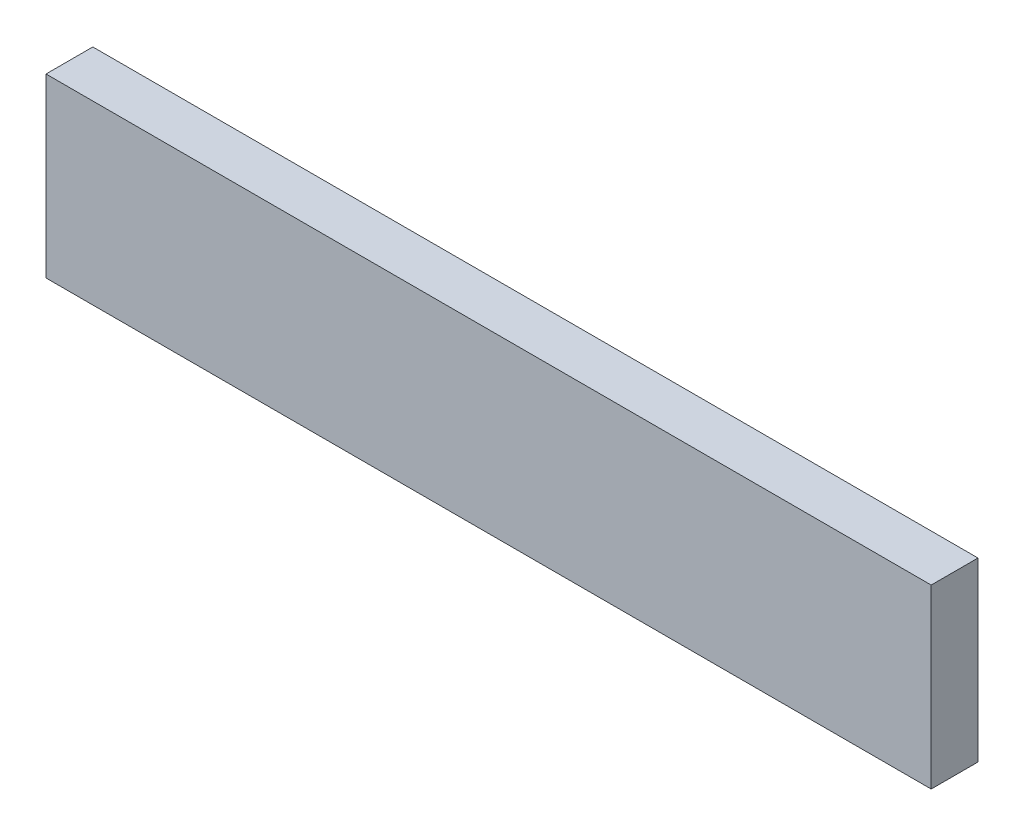
ISO-10303-21;
HEADER;
FILE_DESCRIPTION(('STEP AP214'),'2;1');
FILE_NAME('part.step','',(''),(''),'','','');
FILE_SCHEMA(('AUTOMOTIVE_DESIGN { 1 0 10303 214 1 1 1 1 }'));
ENDSEC;
DATA;
#1=APPLICATION_CONTEXT('core data for automotive mechanical design processes');
#2=APPLICATION_PROTOCOL_DEFINITION('international standard','automotive_design',2000,#1);
#3=PRODUCT_CONTEXT('',#1,'mechanical');
#4=PRODUCT('Part','Part','',(#3));
#5=PRODUCT_RELATED_PRODUCT_CATEGORY('part','',(#4));
#6=PRODUCT_DEFINITION_FORMATION('','',#4);
#7=PRODUCT_DEFINITION_CONTEXT('part definition',#1,'design');
#8=PRODUCT_DEFINITION('design','',#6,#7);
#9=PRODUCT_DEFINITION_SHAPE('','',#8);
#10=(LENGTH_UNIT() NAMED_UNIT(*) SI_UNIT(.MILLI.,.METRE.));
#11=(NAMED_UNIT(*) PLANE_ANGLE_UNIT() SI_UNIT($,.RADIAN.));
#12=(NAMED_UNIT(*) SI_UNIT($,.STERADIAN.) SOLID_ANGLE_UNIT());
#13=UNCERTAINTY_MEASURE_WITH_UNIT(LENGTH_MEASURE(1.E-05),#10,'distance_accuracy_value','');
#14=(GEOMETRIC_REPRESENTATION_CONTEXT(3) GLOBAL_UNCERTAINTY_ASSIGNED_CONTEXT((#13)) GLOBAL_UNIT_ASSIGNED_CONTEXT((#10,
#11,#12)) REPRESENTATION_CONTEXT('',''));
#15=CARTESIAN_POINT('',(0.,0.,0.));
#16=DIRECTION('',(0.,0.,1.));
#17=DIRECTION('',(1.,0.,0.));
#18=AXIS2_PLACEMENT_3D('',#15,#16,#17);
#19=CARTESIAN_POINT('',(2.505,-0.500000000000001,-0.1325));
#20=DIRECTION('',(0.,0.,1.));
#21=DIRECTION('',(1.,0.,0.));
#22=AXIS2_PLACEMENT_3D('',#19,#20,#21);
#23=PLANE('',#22);
#24=DIRECTION('',(0.,1.,0.));
#25=VECTOR('',#24,1.);
#26=CARTESIAN_POINT('',(-2.505,-0.500000000000001,-0.1325));
#27=LINE('',#26,#25);
#28=CARTESIAN_POINT('',(-2.505,-0.500000000000001,-0.1325));
#29=VERTEX_POINT('',#28);
#30=CARTESIAN_POINT('',(-2.505,0.499999999999999,-0.1325));
#31=VERTEX_POINT('',#30);
#32=EDGE_CURVE('E102',#29,#31,#27,.T.);
#33=ORIENTED_EDGE('',*,*,#32,.T.);
#34=DIRECTION('',(-1.,0.,0.));
#35=VECTOR('',#34,1.);
#36=CARTESIAN_POINT('',(2.505,0.499999999999999,-0.1325));
#37=LINE('',#36,#35);
#38=CARTESIAN_POINT('',(2.505,0.499999999999999,-0.1325));
#39=VERTEX_POINT('',#38);
#40=EDGE_CURVE('E11',#39,#31,#37,.T.);
#41=ORIENTED_EDGE('',*,*,#40,.F.);
#42=DIRECTION('',(0.,1.,0.));
#43=VECTOR('',#42,1.);
#44=CARTESIAN_POINT('',(2.505,-0.500000000000001,-0.1325));
#45=LINE('',#44,#43);
#46=CARTESIAN_POINT('',(2.505,-0.500000000000001,-0.1325));
#47=VERTEX_POINT('',#46);
#48=EDGE_CURVE('E90',#47,#39,#45,.T.);
#49=ORIENTED_EDGE('',*,*,#48,.F.);
#50=DIRECTION('',(-1.,0.,0.));
#51=VECTOR('',#50,1.);
#52=CARTESIAN_POINT('',(2.505,-0.500000000000001,-0.1325));
#53=LINE('',#52,#51);
#54=EDGE_CURVE('E98',#47,#29,#53,.T.);
#55=ORIENTED_EDGE('',*,*,#54,.T.);
#56=EDGE_LOOP('',(#33,#41,#49,#55));
#57=FACE_BOUND('',#56,.T.);
#58=ADVANCED_FACE('F39',(#57),#23,.F.);
#59=CARTESIAN_POINT('',(2.505,0.499999999999999,-0.1325));
#60=DIRECTION('',(0.,-1.,0.));
#61=DIRECTION('',(0.,0.,-1.));
#62=AXIS2_PLACEMENT_3D('',#59,#60,#61);
#63=PLANE('',#62);
#64=DIRECTION('',(0.,0.,1.));
#65=VECTOR('',#64,1.);
#66=CARTESIAN_POINT('',(-2.505,0.499999999999999,-0.1325));
#67=LINE('',#66,#65);
#68=CARTESIAN_POINT('',(-2.505,0.499999999999999,0.1325));
#69=VERTEX_POINT('',#68);
#70=EDGE_CURVE('E94',#31,#69,#67,.T.);
#71=ORIENTED_EDGE('',*,*,#70,.T.);
#72=DIRECTION('',(-1.,0.,0.));
#73=VECTOR('',#72,1.);
#74=CARTESIAN_POINT('',(2.505,0.499999999999999,0.1325));
#75=LINE('',#74,#73);
#76=CARTESIAN_POINT('',(2.505,0.499999999999999,0.1325));
#77=VERTEX_POINT('',#76);
#78=EDGE_CURVE('E47',#77,#69,#75,.T.);
#79=ORIENTED_EDGE('',*,*,#78,.F.);
#80=DIRECTION('',(0.,0.,1.));
#81=VECTOR('',#80,1.);
#82=CARTESIAN_POINT('',(2.505,0.499999999999999,-0.1325));
#83=LINE('',#82,#81);
#84=EDGE_CURVE('E85',#39,#77,#83,.T.);
#85=ORIENTED_EDGE('',*,*,#84,.F.);
#86=ORIENTED_EDGE('',*,*,#40,.T.);
#87=EDGE_LOOP('',(#71,#79,#85,#86));
#88=FACE_BOUND('',#87,.T.);
#89=ADVANCED_FACE('F93',(#88),#63,.F.);
#90=CARTESIAN_POINT('',(2.505,-0.500000000000001,0.1325));
#91=DIRECTION('',(0.,0.,-1.));
#92=DIRECTION('',(0.,1.,0.));
#93=AXIS2_PLACEMENT_3D('',#90,#91,#92);
#94=PLANE('',#93);
#95=DIRECTION('',(0.,-1.,0.));
#96=VECTOR('',#95,1.);
#97=CARTESIAN_POINT('',(-2.505,-0.500000000000001,0.1325));
#98=LINE('',#97,#96);
#99=CARTESIAN_POINT('',(-2.505,-0.500000000000001,0.1325));
#100=VERTEX_POINT('',#99);
#101=EDGE_CURVE('E72',#69,#100,#98,.T.);
#102=ORIENTED_EDGE('',*,*,#101,.T.);
#103=DIRECTION('',(-1.,0.,0.));
#104=VECTOR('',#103,1.);
#105=CARTESIAN_POINT('',(2.505,-0.500000000000001,0.1325));
#106=LINE('',#105,#104);
#107=CARTESIAN_POINT('',(2.505,-0.500000000000001,0.1325));
#108=VERTEX_POINT('',#107);
#109=EDGE_CURVE('E95',#108,#100,#106,.T.);
#110=ORIENTED_EDGE('',*,*,#109,.F.);
#111=DIRECTION('',(0.,-1.,0.));
#112=VECTOR('',#111,1.);
#113=CARTESIAN_POINT('',(2.505,-0.500000000000001,0.1325));
#114=LINE('',#113,#112);
#115=EDGE_CURVE('E88',#77,#108,#114,.T.);
#116=ORIENTED_EDGE('',*,*,#115,.F.);
#117=ORIENTED_EDGE('',*,*,#78,.T.);
#118=EDGE_LOOP('',(#102,#110,#116,#117));
#119=FACE_BOUND('',#118,.T.);
#120=ADVANCED_FACE('F96',(#119),#94,.F.);
#121=CARTESIAN_POINT('',(2.505,-0.500000000000001,-0.1325));
#122=DIRECTION('',(0.,1.,0.));
#123=DIRECTION('',(0.,0.,1.));
#124=AXIS2_PLACEMENT_3D('',#121,#122,#123);
#125=PLANE('',#124);
#126=DIRECTION('',(0.,0.,-1.));
#127=VECTOR('',#126,1.);
#128=CARTESIAN_POINT('',(-2.505,-0.500000000000001,-0.1325));
#129=LINE('',#128,#127);
#130=EDGE_CURVE('E78',#100,#29,#129,.T.);
#131=ORIENTED_EDGE('',*,*,#130,.T.);
#132=ORIENTED_EDGE('',*,*,#54,.F.);
#133=DIRECTION('',(0.,0.,-1.));
#134=VECTOR('',#133,1.);
#135=CARTESIAN_POINT('',(2.505,-0.500000000000001,-0.1325));
#136=LINE('',#135,#134);
#137=EDGE_CURVE('E55',#108,#47,#136,.T.);
#138=ORIENTED_EDGE('',*,*,#137,.F.);
#139=ORIENTED_EDGE('',*,*,#109,.T.);
#140=EDGE_LOOP('',(#131,#132,#138,#139));
#141=FACE_BOUND('',#140,.T.);
#142=ADVANCED_FACE('F109',(#141),#125,.F.);
#143=CARTESIAN_POINT('',(2.505,0.,0.));
#144=DIRECTION('',(1.,0.,0.));
#145=DIRECTION('',(0.,0.,-1.));
#146=AXIS2_PLACEMENT_3D('',#143,#144,#145);
#147=PLANE('',#146);
#148=ORIENTED_EDGE('',*,*,#48,.T.);
#149=ORIENTED_EDGE('',*,*,#84,.T.);
#150=ORIENTED_EDGE('',*,*,#115,.T.);
#151=ORIENTED_EDGE('',*,*,#137,.T.);
#152=EDGE_LOOP('',(#148,#149,#150,#151));
#153=FACE_BOUND('',#152,.T.);
#154=ADVANCED_FACE('F86',(#153),#147,.T.);
#155=CARTESIAN_POINT('',(-2.505,0.,0.));
#156=DIRECTION('',(1.,0.,0.));
#157=DIRECTION('',(0.,0.,-1.));
#158=AXIS2_PLACEMENT_3D('',#155,#156,#157);
#159=PLANE('',#158);
#160=ORIENTED_EDGE('',*,*,#32,.F.);
#161=ORIENTED_EDGE('',*,*,#130,.F.);
#162=ORIENTED_EDGE('',*,*,#101,.F.);
#163=ORIENTED_EDGE('',*,*,#70,.F.);
#164=EDGE_LOOP('',(#160,#161,#162,#163));
#165=FACE_BOUND('',#164,.T.);
#166=ADVANCED_FACE('F112',(#165),#159,.F.);
#167=CLOSED_SHELL('',(#58,#89,#120,#142,#154,#166));
#168=MANIFOLD_SOLID_BREP('B2',#167);
#169=ADVANCED_BREP_SHAPE_REPRESENTATION('',(#18,#168),#14);
#170=SHAPE_DEFINITION_REPRESENTATION(#9,#169);
ENDSEC;
END-ISO-10303-21;
